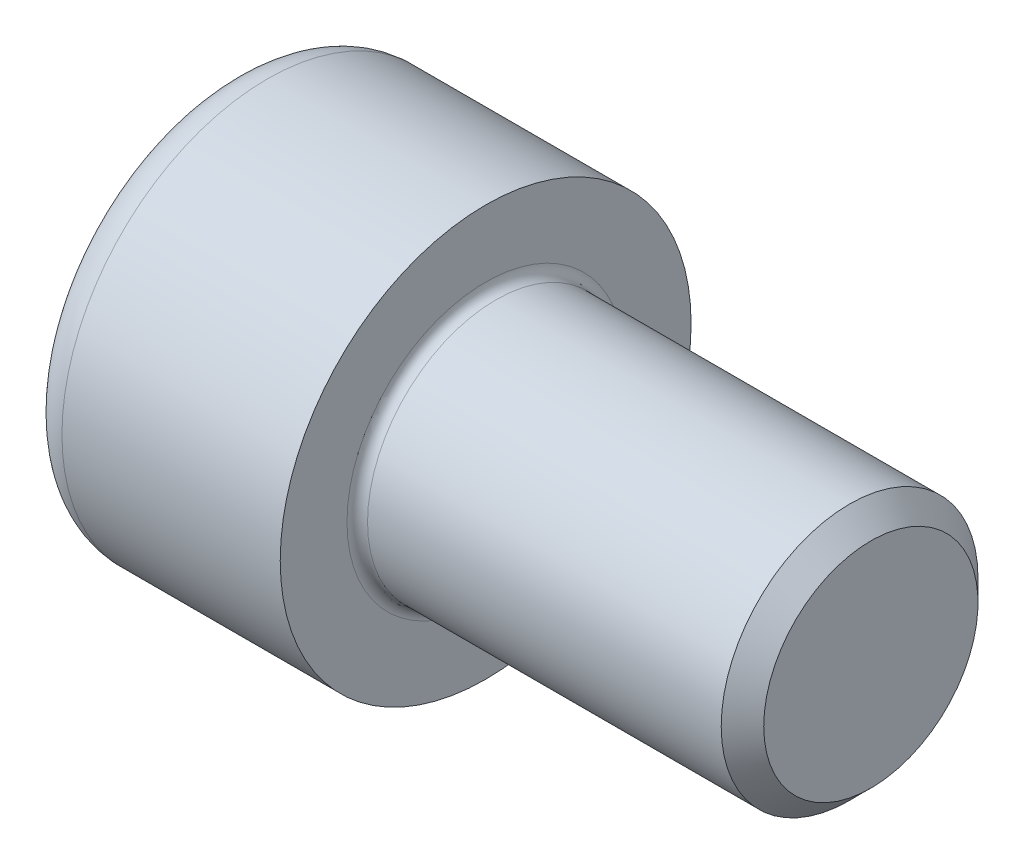
ISO-10303-21;
HEADER;
FILE_DESCRIPTION(('STEP AP214'),'2;1');
FILE_NAME('part.step','',(''),(''),'','','');
FILE_SCHEMA(('AUTOMOTIVE_DESIGN { 1 0 10303 214 1 1 1 1 }'));
ENDSEC;
DATA;
#1=APPLICATION_CONTEXT('core data for automotive mechanical design processes');
#2=APPLICATION_PROTOCOL_DEFINITION('international standard','automotive_design',2000,#1);
#3=PRODUCT_CONTEXT('',#1,'mechanical');
#4=PRODUCT('Part','Part','',(#3));
#5=PRODUCT_RELATED_PRODUCT_CATEGORY('part','',(#4));
#6=PRODUCT_DEFINITION_FORMATION('','',#4);
#7=PRODUCT_DEFINITION_CONTEXT('part definition',#1,'design');
#8=PRODUCT_DEFINITION('design','',#6,#7);
#9=PRODUCT_DEFINITION_SHAPE('','',#8);
#10=(LENGTH_UNIT() NAMED_UNIT(*) SI_UNIT(.MILLI.,.METRE.));
#11=(NAMED_UNIT(*) PLANE_ANGLE_UNIT() SI_UNIT($,.RADIAN.));
#12=(NAMED_UNIT(*) SI_UNIT($,.STERADIAN.) SOLID_ANGLE_UNIT());
#13=UNCERTAINTY_MEASURE_WITH_UNIT(LENGTH_MEASURE(1.E-05),#10,'distance_accuracy_value','');
#14=(GEOMETRIC_REPRESENTATION_CONTEXT(3) GLOBAL_UNCERTAINTY_ASSIGNED_CONTEXT((#13)) GLOBAL_UNIT_ASSIGNED_CONTEXT((#10,
#11,#12)) REPRESENTATION_CONTEXT('',''));
#15=CARTESIAN_POINT('',(0.,0.,0.));
#16=DIRECTION('',(0.,0.,1.));
#17=DIRECTION('',(1.,0.,0.));
#18=AXIS2_PLACEMENT_3D('',#15,#16,#17);
#19=CARTESIAN_POINT('',(0.,0.,0.));
#20=DIRECTION('',(-1.,0.,0.));
#21=DIRECTION('',(0.,0.,1.));
#22=AXIS2_PLACEMENT_3D('',#19,#20,#21);
#23=PLANE('',#22);
#24=DIRECTION('',(0.,-0.499999999999999,0.866025403784439));
#25=VECTOR('',#24,1.);
#26=CARTESIAN_POINT('',(0.,4.68519743447381,0.));
#27=LINE('',#26,#25);
#28=CARTESIAN_POINT('',(0.,4.68519743447381,0.));
#29=VERTEX_POINT('',#28);
#30=CARTESIAN_POINT('',(0.,2.34259871723691,4.05749999999999));
#31=VERTEX_POINT('',#30);
#32=EDGE_CURVE('E263',#29,#31,#27,.T.);
#33=ORIENTED_EDGE('',*,*,#32,.T.);
#34=DIRECTION('',(0.,1.,0.));
#35=VECTOR('',#34,1.);
#36=CARTESIAN_POINT('',(0.,-2.3425987172369,4.0575));
#37=LINE('',#36,#35);
#38=CARTESIAN_POINT('',(0.,-2.3425987172369,4.0575));
#39=VERTEX_POINT('',#38);
#40=EDGE_CURVE('E135',#39,#31,#37,.T.);
#41=ORIENTED_EDGE('',*,*,#40,.F.);
#42=DIRECTION('',(0.,-0.500000000000001,-0.866025403784438));
#43=VECTOR('',#42,1.);
#44=CARTESIAN_POINT('',(0.,-2.3425987172369,4.0575));
#45=LINE('',#44,#43);
#46=CARTESIAN_POINT('',(0.,-4.68519743447382,0.));
#47=VERTEX_POINT('',#46);
#48=EDGE_CURVE('E266',#39,#47,#45,.T.);
#49=ORIENTED_EDGE('',*,*,#48,.T.);
#50=DIRECTION('',(0.,0.499999999999999,-0.866025403784439));
#51=VECTOR('',#50,1.);
#52=CARTESIAN_POINT('',(0.,-4.68519743447382,0.));
#53=LINE('',#52,#51);
#54=CARTESIAN_POINT('',(0.,-2.34259871723692,-4.0575));
#55=VERTEX_POINT('',#54);
#56=EDGE_CURVE('E269',#47,#55,#53,.T.);
#57=ORIENTED_EDGE('',*,*,#56,.T.);
#58=DIRECTION('',(0.,-1.,0.));
#59=VECTOR('',#58,1.);
#60=CARTESIAN_POINT('',(0.,2.3425987172369,-4.05750000000001));
#61=LINE('',#60,#59);
#62=CARTESIAN_POINT('',(0.,2.3425987172369,-4.05750000000001));
#63=VERTEX_POINT('',#62);
#64=EDGE_CURVE('E272',#63,#55,#61,.T.);
#65=ORIENTED_EDGE('',*,*,#64,.F.);
#66=DIRECTION('',(0.,-0.500000000000001,-0.866025403784438));
#67=VECTOR('',#66,1.);
#68=CARTESIAN_POINT('',(0.,4.68519743447381,0.));
#69=LINE('',#68,#67);
#70=EDGE_CURVE('E130',#29,#63,#69,.T.);
#71=ORIENTED_EDGE('',*,*,#70,.F.);
#72=EDGE_LOOP('',(#33,#41,#49,#57,#65,#71));
#73=FACE_BOUND('',#72,.T.);
#74=CARTESIAN_POINT('',(0.,0.,0.));
#75=DIRECTION('',(-1.,0.,0.));
#76=DIRECTION('',(0.,0.,1.));
#77=AXIS2_PLACEMENT_3D('',#74,#75,#76);
#78=CIRCLE('',#77,6.5);
#79=CARTESIAN_POINT('',(0.,0.,6.5));
#80=VERTEX_POINT('',#79);
#81=EDGE_CURVE('E47',#80,#80,#78,.T.);
#82=ORIENTED_EDGE('',*,*,#81,.T.);
#83=EDGE_LOOP('',(#82));
#84=FACE_BOUND('',#83,.T.);
#85=ADVANCED_FACE('F39',(#73,#84),#23,.T.);
#86=CARTESIAN_POINT('',(-31.75,0.,0.));
#87=DIRECTION('',(-1.,0.,0.));
#88=DIRECTION('',(0.,0.,1.));
#89=AXIS2_PLACEMENT_3D('',#86,#87,#88);
#90=CYLINDRICAL_SURFACE('',#89,8.);
#91=CARTESIAN_POINT('',(1.5,0.,0.));
#92=DIRECTION('',(-1.,0.,0.));
#93=DIRECTION('',(0.,0.,1.));
#94=AXIS2_PLACEMENT_3D('',#91,#92,#93);
#95=CIRCLE('',#94,8.);
#96=CARTESIAN_POINT('',(1.5,0.,8.));
#97=VERTEX_POINT('',#96);
#98=EDGE_CURVE('E11',#97,#97,#95,.F.);
#99=ORIENTED_EDGE('',*,*,#98,.T.);
#100=EDGE_LOOP('',(#99));
#101=FACE_BOUND('',#100,.T.);
#102=CARTESIAN_POINT('',(10.,0.,0.));
#103=DIRECTION('',(-1.,0.,0.));
#104=DIRECTION('',(0.,0.,1.));
#105=AXIS2_PLACEMENT_3D('',#102,#103,#104);
#106=CIRCLE('',#105,8.);
#107=CARTESIAN_POINT('',(10.,0.,8.));
#108=VERTEX_POINT('',#107);
#109=EDGE_CURVE('E153',#108,#108,#106,.T.);
#110=ORIENTED_EDGE('',*,*,#109,.T.);
#111=EDGE_LOOP('',(#110));
#112=FACE_BOUND('',#111,.T.);
#113=ADVANCED_FACE('F177',(#101,#112),#90,.T.);
#114=CARTESIAN_POINT('',(10.,8.,0.));
#115=DIRECTION('',(1.,0.,0.));
#116=DIRECTION('',(0.,0.,-1.));
#117=AXIS2_PLACEMENT_3D('',#114,#115,#116);
#118=PLANE('',#117);
#119=CARTESIAN_POINT('',(10.,0.,0.));
#120=DIRECTION('',(1.,0.,0.));
#121=DIRECTION('',(0.,0.,-1.));
#122=AXIS2_PLACEMENT_3D('',#119,#120,#121);
#123=CIRCLE('',#122,5.39999999999992);
#124=CARTESIAN_POINT('',(10.,0.,-5.39999999999992));
#125=VERTEX_POINT('',#124);
#126=EDGE_CURVE('E156',#125,#125,#123,.F.);
#127=ORIENTED_EDGE('',*,*,#126,.T.);
#128=EDGE_LOOP('',(#127));
#129=FACE_BOUND('',#128,.T.);
#130=ORIENTED_EDGE('',*,*,#109,.F.);
#131=EDGE_LOOP('',(#130));
#132=FACE_BOUND('',#131,.T.);
#133=ADVANCED_FACE('F183',(#129,#132),#118,.T.);
#134=CARTESIAN_POINT('',(-31.75,0.,0.));
#135=DIRECTION('',(-1.,0.,0.));
#136=DIRECTION('',(0.,0.,1.));
#137=AXIS2_PLACEMENT_3D('',#134,#135,#136);
#138=CYLINDRICAL_SURFACE('',#137,4.99999999999992);
#139=CARTESIAN_POINT('',(10.4,0.,0.));
#140=DIRECTION('',(1.,0.,0.));
#141=DIRECTION('',(0.,0.,-1.));
#142=AXIS2_PLACEMENT_3D('',#139,#140,#141);
#143=CIRCLE('',#142,4.99999999999992);
#144=CARTESIAN_POINT('',(10.4,0.,-4.99999999999992));
#145=VERTEX_POINT('',#144);
#146=EDGE_CURVE('E159',#145,#145,#143,.T.);
#147=ORIENTED_EDGE('',*,*,#146,.T.);
#148=EDGE_LOOP('',(#147));
#149=FACE_BOUND('',#148,.T.);
#150=CARTESIAN_POINT('',(24.1719999999999,0.,0.));
#151=DIRECTION('',(-1.,0.,0.));
#152=DIRECTION('',(0.,0.,1.));
#153=AXIS2_PLACEMENT_3D('',#150,#151,#152);
#154=CIRCLE('',#153,4.99999999999985);
#155=CARTESIAN_POINT('',(24.1719999999999,0.,4.99999999999985));
#156=VERTEX_POINT('',#155);
#157=EDGE_CURVE('E150',#156,#156,#154,.T.);
#158=ORIENTED_EDGE('',*,*,#157,.T.);
#159=EDGE_LOOP('',(#158));
#160=FACE_BOUND('',#159,.T.);
#161=ADVANCED_FACE('F189',(#149,#160),#138,.T.);
#162=CARTESIAN_POINT('',(25.,0.,0.));
#163=DIRECTION('',(-1.,0.,0.));
#164=DIRECTION('',(0.,0.,1.));
#165=AXIS2_PLACEMENT_3D('',#162,#163,#164);
#166=CONICAL_SURFACE('',#165,4.172,0.785398163397283);
#167=ORIENTED_EDGE('',*,*,#157,.F.);
#168=EDGE_LOOP('',(#167));
#169=FACE_BOUND('',#168,.T.);
#170=CARTESIAN_POINT('',(25.,0.,0.));
#171=DIRECTION('',(-1.,0.,0.));
#172=DIRECTION('',(0.,0.,1.));
#173=AXIS2_PLACEMENT_3D('',#170,#171,#172);
#174=CIRCLE('',#173,4.172);
#175=CARTESIAN_POINT('',(25.,0.,4.172));
#176=VERTEX_POINT('',#175);
#177=EDGE_CURVE('E146',#176,#176,#174,.T.);
#178=ORIENTED_EDGE('',*,*,#177,.T.);
#179=EDGE_LOOP('',(#178));
#180=FACE_BOUND('',#179,.T.);
#181=ADVANCED_FACE('F193',(#169,#180),#166,.T.);
#182=CARTESIAN_POINT('',(25.,4.172,0.));
#183=DIRECTION('',(1.,0.,0.));
#184=DIRECTION('',(0.,0.,-1.));
#185=AXIS2_PLACEMENT_3D('',#182,#183,#184);
#186=PLANE('',#185);
#187=ORIENTED_EDGE('',*,*,#177,.F.);
#188=EDGE_LOOP('',(#187));
#189=FACE_BOUND('',#188,.T.);
#190=ADVANCED_FACE('F173',(#189),#186,.T.);
#191=CARTESIAN_POINT('',(10.4,0.,0.));
#192=DIRECTION('',(1.,0.,0.));
#193=DIRECTION('',(0.,0.,-1.));
#194=AXIS2_PLACEMENT_3D('',#191,#192,#193);
#195=TOROIDAL_SURFACE('',#194,5.39999999999992,0.4);
#196=ORIENTED_EDGE('',*,*,#146,.F.);
#197=EDGE_LOOP('',(#196));
#198=FACE_BOUND('',#197,.T.);
#199=ORIENTED_EDGE('',*,*,#126,.F.);
#200=EDGE_LOOP('',(#199));
#201=FACE_BOUND('',#200,.T.);
#202=ADVANCED_FACE('F166',(#198,#201),#195,.F.);
#203=CARTESIAN_POINT('',(1.5,0.,0.));
#204=DIRECTION('',(-1.,0.,0.));
#205=DIRECTION('',(0.,0.,1.));
#206=AXIS2_PLACEMENT_3D('',#203,#204,#205);
#207=TOROIDAL_SURFACE('',#206,6.5,1.5);
#208=ORIENTED_EDGE('',*,*,#98,.F.);
#209=EDGE_LOOP('',(#208));
#210=FACE_BOUND('',#209,.T.);
#211=ORIENTED_EDGE('',*,*,#81,.F.);
#212=EDGE_LOOP('',(#211));
#213=FACE_BOUND('',#212,.T.);
#214=ADVANCED_FACE('F41',(#210,#213),#207,.T.);
#215=CARTESIAN_POINT('',(5.,4.68519743447381,0.));
#216=DIRECTION('',(0.,-0.866025403784439,-0.499999999999999));
#217=DIRECTION('',(0.,0.499999999999999,-0.866025403784439));
#218=AXIS2_PLACEMENT_3D('',#215,#216,#217);
#219=PLANE('',#218);
#220=ORIENTED_EDGE('',*,*,#32,.F.);
#221=DIRECTION('',(-1.,0.,0.));
#222=VECTOR('',#221,1.);
#223=CARTESIAN_POINT('',(5.,4.68519743447381,0.));
#224=LINE('',#223,#222);
#225=CARTESIAN_POINT('',(5.,4.68519743447381,0.));
#226=VERTEX_POINT('',#225);
#227=EDGE_CURVE('E253',#226,#29,#224,.T.);
#228=ORIENTED_EDGE('',*,*,#227,.F.);
#229=DIRECTION('',(0.,-0.499999999999999,0.866025403784439));
#230=VECTOR('',#229,1.);
#231=CARTESIAN_POINT('',(5.,4.68519743447381,0.));
#232=LINE('',#231,#230);
#233=CARTESIAN_POINT('',(5.,3.51389807585536,2.02874999999999));
#234=VERTEX_POINT('',#233);
#235=EDGE_CURVE('E122',#226,#234,#232,.T.);
#236=ORIENTED_EDGE('',*,*,#235,.T.);
#237=CARTESIAN_POINT('',(5.,2.34259871723691,4.05749999999999));
#238=VERTEX_POINT('',#237);
#239=EDGE_CURVE('E113',#234,#238,#232,.T.);
#240=ORIENTED_EDGE('',*,*,#239,.T.);
#241=DIRECTION('',(-1.,0.,0.));
#242=VECTOR('',#241,1.);
#243=CARTESIAN_POINT('',(5.,2.34259871723691,4.05749999999999));
#244=LINE('',#243,#242);
#245=EDGE_CURVE('E127',#238,#31,#244,.T.);
#246=ORIENTED_EDGE('',*,*,#245,.T.);
#247=EDGE_LOOP('',(#220,#228,#236,#240,#246));
#248=FACE_BOUND('',#247,.T.);
#249=ADVANCED_FACE('F126',(#248),#219,.T.);
#250=CARTESIAN_POINT('',(5.,-2.3425987172369,4.0575));
#251=DIRECTION('',(0.,0.,1.));
#252=DIRECTION('',(0.,-1.,0.));
#253=AXIS2_PLACEMENT_3D('',#250,#251,#252);
#254=PLANE('',#253);
#255=ORIENTED_EDGE('',*,*,#40,.T.);
#256=ORIENTED_EDGE('',*,*,#245,.F.);
#257=DIRECTION('',(0.,1.,0.));
#258=VECTOR('',#257,1.);
#259=CARTESIAN_POINT('',(5.,-2.3425987172369,4.0575));
#260=LINE('',#259,#258);
#261=CARTESIAN_POINT('',(5.,0.,4.0575));
#262=VERTEX_POINT('',#261);
#263=EDGE_CURVE('E110',#262,#238,#260,.T.);
#264=ORIENTED_EDGE('',*,*,#263,.F.);
#265=CARTESIAN_POINT('',(5.,-2.3425987172369,4.0575));
#266=VERTEX_POINT('',#265);
#267=EDGE_CURVE('E121',#266,#262,#260,.T.);
#268=ORIENTED_EDGE('',*,*,#267,.F.);
#269=DIRECTION('',(-1.,0.,0.));
#270=VECTOR('',#269,1.);
#271=CARTESIAN_POINT('',(5.,-2.3425987172369,4.0575));
#272=LINE('',#271,#270);
#273=EDGE_CURVE('E137',#266,#39,#272,.T.);
#274=ORIENTED_EDGE('',*,*,#273,.T.);
#275=EDGE_LOOP('',(#255,#256,#264,#268,#274));
#276=FACE_BOUND('',#275,.T.);
#277=ADVANCED_FACE('F132',(#276),#254,.F.);
#278=CARTESIAN_POINT('',(5.,-2.3425987172369,4.0575));
#279=DIRECTION('',(0.,0.866025403784438,-0.500000000000001));
#280=DIRECTION('',(0.,0.500000000000001,0.866025403784438));
#281=AXIS2_PLACEMENT_3D('',#278,#279,#280);
#282=PLANE('',#281);
#283=ORIENTED_EDGE('',*,*,#48,.F.);
#284=ORIENTED_EDGE('',*,*,#273,.F.);
#285=DIRECTION('',(0.,-0.500000000000001,-0.866025403784438));
#286=VECTOR('',#285,1.);
#287=CARTESIAN_POINT('',(5.,-2.3425987172369,4.0575));
#288=LINE('',#287,#286);
#289=CARTESIAN_POINT('',(5.,-3.51389807585536,2.02875));
#290=VERTEX_POINT('',#289);
#291=EDGE_CURVE('E292',#266,#290,#288,.T.);
#292=ORIENTED_EDGE('',*,*,#291,.T.);
#293=CARTESIAN_POINT('',(5.,-4.68519743447382,0.));
#294=VERTEX_POINT('',#293);
#295=EDGE_CURVE('E281',#290,#294,#288,.T.);
#296=ORIENTED_EDGE('',*,*,#295,.T.);
#297=DIRECTION('',(-1.,0.,0.));
#298=VECTOR('',#297,1.);
#299=CARTESIAN_POINT('',(5.,-4.68519743447382,0.));
#300=LINE('',#299,#298);
#301=EDGE_CURVE('E142',#294,#47,#300,.T.);
#302=ORIENTED_EDGE('',*,*,#301,.T.);
#303=EDGE_LOOP('',(#283,#284,#292,#296,#302));
#304=FACE_BOUND('',#303,.T.);
#305=ADVANCED_FACE('F207',(#304),#282,.T.);
#306=CARTESIAN_POINT('',(5.,-4.68519743447382,0.));
#307=DIRECTION('',(0.,0.866025403784439,0.499999999999999));
#308=DIRECTION('',(0.,-0.499999999999999,0.866025403784439));
#309=AXIS2_PLACEMENT_3D('',#306,#307,#308);
#310=PLANE('',#309);
#311=ORIENTED_EDGE('',*,*,#56,.F.);
#312=ORIENTED_EDGE('',*,*,#301,.F.);
#313=DIRECTION('',(0.,0.499999999999999,-0.866025403784439));
#314=VECTOR('',#313,1.);
#315=CARTESIAN_POINT('',(5.,-4.68519743447382,0.));
#316=LINE('',#315,#314);
#317=CARTESIAN_POINT('',(5.,-3.51389807585537,-2.02875));
#318=VERTEX_POINT('',#317);
#319=EDGE_CURVE('E259',#294,#318,#316,.T.);
#320=ORIENTED_EDGE('',*,*,#319,.T.);
#321=CARTESIAN_POINT('',(5.,-2.34259871723692,-4.0575));
#322=VERTEX_POINT('',#321);
#323=EDGE_CURVE('E291',#318,#322,#316,.T.);
#324=ORIENTED_EDGE('',*,*,#323,.T.);
#325=DIRECTION('',(-1.,0.,0.));
#326=VECTOR('',#325,1.);
#327=CARTESIAN_POINT('',(5.,-2.34259871723692,-4.0575));
#328=LINE('',#327,#326);
#329=EDGE_CURVE('E252',#322,#55,#328,.T.);
#330=ORIENTED_EDGE('',*,*,#329,.T.);
#331=EDGE_LOOP('',(#311,#312,#320,#324,#330));
#332=FACE_BOUND('',#331,.T.);
#333=ADVANCED_FACE('F210',(#332),#310,.T.);
#334=CARTESIAN_POINT('',(5.,2.3425987172369,-4.05750000000001));
#335=DIRECTION('',(0.,0.,-1.));
#336=DIRECTION('',(0.,1.,0.));
#337=AXIS2_PLACEMENT_3D('',#334,#335,#336);
#338=PLANE('',#337);
#339=ORIENTED_EDGE('',*,*,#64,.T.);
#340=ORIENTED_EDGE('',*,*,#329,.F.);
#341=DIRECTION('',(0.,-1.,0.));
#342=VECTOR('',#341,1.);
#343=CARTESIAN_POINT('',(5.,2.3425987172369,-4.05750000000001));
#344=LINE('',#343,#342);
#345=CARTESIAN_POINT('',(5.,0.,-4.0575));
#346=VERTEX_POINT('',#345);
#347=EDGE_CURVE('E256',#346,#322,#344,.T.);
#348=ORIENTED_EDGE('',*,*,#347,.F.);
#349=CARTESIAN_POINT('',(5.,2.3425987172369,-4.05750000000001));
#350=VERTEX_POINT('',#349);
#351=EDGE_CURVE('E54',#350,#346,#344,.T.);
#352=ORIENTED_EDGE('',*,*,#351,.F.);
#353=DIRECTION('',(-1.,0.,0.));
#354=VECTOR('',#353,1.);
#355=CARTESIAN_POINT('',(5.,2.3425987172369,-4.05750000000001));
#356=LINE('',#355,#354);
#357=EDGE_CURVE('E249',#350,#63,#356,.T.);
#358=ORIENTED_EDGE('',*,*,#357,.T.);
#359=EDGE_LOOP('',(#339,#340,#348,#352,#358));
#360=FACE_BOUND('',#359,.T.);
#361=ADVANCED_FACE('F214',(#360),#338,.F.);
#362=CARTESIAN_POINT('',(5.,4.68519743447381,0.));
#363=DIRECTION('',(0.,0.866025403784438,-0.500000000000001));
#364=DIRECTION('',(0.,0.500000000000001,0.866025403784438));
#365=AXIS2_PLACEMENT_3D('',#362,#363,#364);
#366=PLANE('',#365);
#367=ORIENTED_EDGE('',*,*,#70,.T.);
#368=ORIENTED_EDGE('',*,*,#357,.F.);
#369=DIRECTION('',(0.,-0.500000000000001,-0.866025403784438));
#370=VECTOR('',#369,1.);
#371=CARTESIAN_POINT('',(5.,4.68519743447381,0.));
#372=LINE('',#371,#370);
#373=CARTESIAN_POINT('',(5.,3.51389807585536,-2.02875));
#374=VERTEX_POINT('',#373);
#375=EDGE_CURVE('E239',#374,#350,#372,.T.);
#376=ORIENTED_EDGE('',*,*,#375,.F.);
#377=EDGE_CURVE('E245',#226,#374,#372,.T.);
#378=ORIENTED_EDGE('',*,*,#377,.F.);
#379=ORIENTED_EDGE('',*,*,#227,.T.);
#380=EDGE_LOOP('',(#367,#368,#376,#378,#379));
#381=FACE_BOUND('',#380,.T.);
#382=ADVANCED_FACE('F218',(#381),#366,.F.);
#383=CARTESIAN_POINT('',(5.,4.68519743447381,0.));
#384=DIRECTION('',(1.,0.,0.));
#385=DIRECTION('',(0.,0.,-1.));
#386=AXIS2_PLACEMENT_3D('',#383,#384,#385);
#387=PLANE('',#386);
#388=ORIENTED_EDGE('',*,*,#347,.T.);
#389=ORIENTED_EDGE('',*,*,#323,.F.);
#390=CARTESIAN_POINT('',(5.,0.,0.));
#391=DIRECTION('',(-1.,0.,0.));
#392=DIRECTION('',(0.,0.,1.));
#393=AXIS2_PLACEMENT_3D('',#390,#391,#392);
#394=CIRCLE('',#393,4.0575);
#395=EDGE_CURVE('E287',#346,#318,#394,.T.);
#396=ORIENTED_EDGE('',*,*,#395,.F.);
#397=EDGE_LOOP('',(#388,#389,#396));
#398=FACE_BOUND('',#397,.T.);
#399=ADVANCED_FACE('F222',(#398),#387,.F.);
#400=ORIENTED_EDGE('',*,*,#319,.F.);
#401=ORIENTED_EDGE('',*,*,#295,.F.);
#402=EDGE_CURVE('E140',#318,#290,#394,.T.);
#403=ORIENTED_EDGE('',*,*,#402,.F.);
#404=EDGE_LOOP('',(#400,#401,#403));
#405=FACE_BOUND('',#404,.T.);
#406=ADVANCED_FACE('F225',(#405),#387,.F.);
#407=ORIENTED_EDGE('',*,*,#291,.F.);
#408=ORIENTED_EDGE('',*,*,#267,.T.);
#409=EDGE_CURVE('E136',#290,#262,#394,.T.);
#410=ORIENTED_EDGE('',*,*,#409,.F.);
#411=EDGE_LOOP('',(#407,#408,#410));
#412=FACE_BOUND('',#411,.T.);
#413=ADVANCED_FACE('F230',(#412),#387,.F.);
#414=ORIENTED_EDGE('',*,*,#263,.T.);
#415=ORIENTED_EDGE('',*,*,#239,.F.);
#416=EDGE_CURVE('E116',#262,#234,#394,.T.);
#417=ORIENTED_EDGE('',*,*,#416,.F.);
#418=EDGE_LOOP('',(#414,#415,#417));
#419=FACE_BOUND('',#418,.T.);
#420=ADVANCED_FACE('F112',(#419),#387,.F.);
#421=ORIENTED_EDGE('',*,*,#235,.F.);
#422=ORIENTED_EDGE('',*,*,#377,.T.);
#423=EDGE_CURVE('E147',#234,#374,#394,.T.);
#424=ORIENTED_EDGE('',*,*,#423,.F.);
#425=EDGE_LOOP('',(#421,#422,#424));
#426=FACE_BOUND('',#425,.T.);
#427=ADVANCED_FACE('F233',(#426),#387,.F.);
#428=ORIENTED_EDGE('',*,*,#375,.T.);
#429=ORIENTED_EDGE('',*,*,#351,.T.);
#430=EDGE_CURVE('E242',#374,#346,#394,.T.);
#431=ORIENTED_EDGE('',*,*,#430,.F.);
#432=EDGE_LOOP('',(#428,#429,#431));
#433=FACE_BOUND('',#432,.T.);
#434=ADVANCED_FACE('F203',(#433),#387,.F.);
#435=CARTESIAN_POINT('',(5.,0.,0.));
#436=DIRECTION('',(-1.,0.,0.));
#437=DIRECTION('',(0.,0.,1.));
#438=AXIS2_PLACEMENT_3D('',#435,#436,#437);
#439=CONICAL_SURFACE('',#438,4.0575,1.04719755119659);
#440=CARTESIAN_POINT('',(7.34259871723693,0.,0.));
#441=VERTEX_POINT('',#440);
#442=VERTEX_LOOP('',#441);
#443=FACE_BOUND('',#442,.T.);
#444=ORIENTED_EDGE('',*,*,#416,.T.);
#445=ORIENTED_EDGE('',*,*,#423,.T.);
#446=ORIENTED_EDGE('',*,*,#430,.T.);
#447=ORIENTED_EDGE('',*,*,#395,.T.);
#448=ORIENTED_EDGE('',*,*,#402,.T.);
#449=ORIENTED_EDGE('',*,*,#409,.T.);
#450=EDGE_LOOP('',(#444,#445,#446,#447,#448,#449));
#451=FACE_BOUND('',#450,.T.);
#452=ADVANCED_FACE('F201',(#443,#451),#439,.F.);
#453=CLOSED_SHELL('',(#85,#113,#133,#161,#181,#190,#202,#214,#249,#277,#305,#333,#361,#382,#399,
#406,#413,#420,#427,#434,#452));
#454=MANIFOLD_SOLID_BREP('B2',#453);
#455=ADVANCED_BREP_SHAPE_REPRESENTATION('',(#18,#454),#14);
#456=SHAPE_DEFINITION_REPRESENTATION(#9,#455);
ENDSEC;
END-ISO-10303-21;
